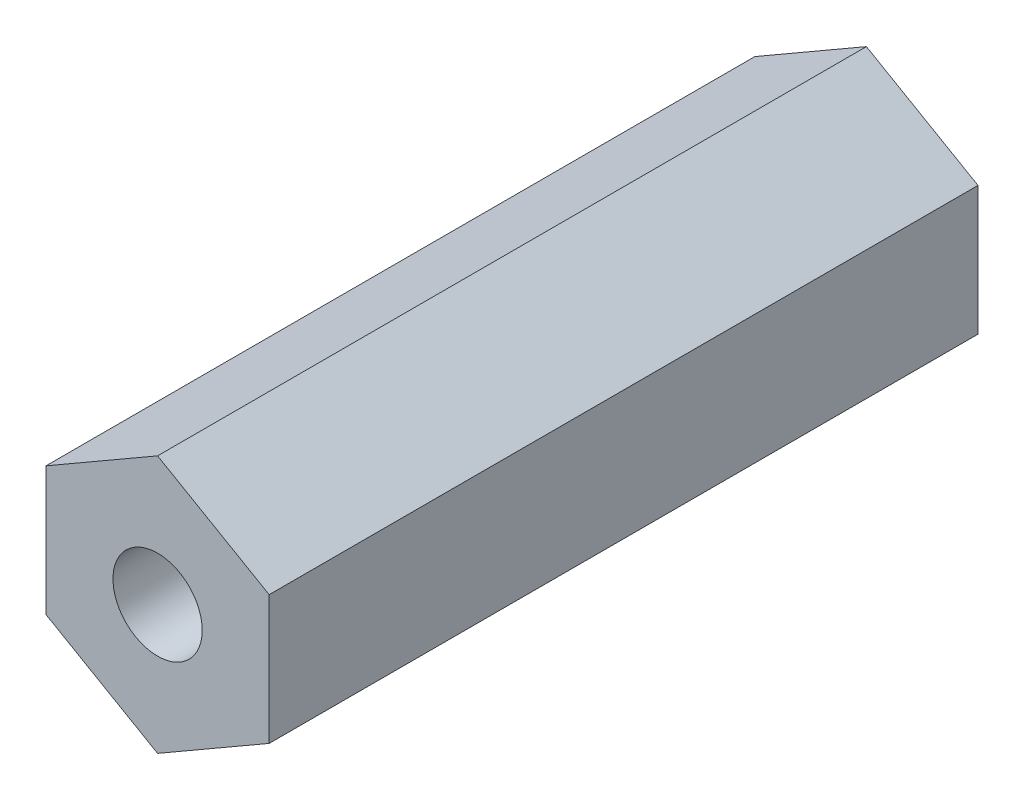
ISO-10303-21;
HEADER;
FILE_DESCRIPTION(('STEP AP214'),'2;1');
FILE_NAME('part.step','',(''),(''),'','','');
FILE_SCHEMA(('AUTOMOTIVE_DESIGN { 1 0 10303 214 1 1 1 1 }'));
ENDSEC;
DATA;
#1=APPLICATION_CONTEXT('core data for automotive mechanical design processes');
#2=APPLICATION_PROTOCOL_DEFINITION('international standard','automotive_design',2000,#1);
#3=PRODUCT_CONTEXT('',#1,'mechanical');
#4=PRODUCT('Part','Part','',(#3));
#5=PRODUCT_RELATED_PRODUCT_CATEGORY('part','',(#4));
#6=PRODUCT_DEFINITION_FORMATION('','',#4);
#7=PRODUCT_DEFINITION_CONTEXT('part definition',#1,'design');
#8=PRODUCT_DEFINITION('design','',#6,#7);
#9=PRODUCT_DEFINITION_SHAPE('','',#8);
#10=(LENGTH_UNIT() NAMED_UNIT(*) SI_UNIT(.MILLI.,.METRE.));
#11=(NAMED_UNIT(*) PLANE_ANGLE_UNIT() SI_UNIT($,.RADIAN.));
#12=(NAMED_UNIT(*) SI_UNIT($,.STERADIAN.) SOLID_ANGLE_UNIT());
#13=UNCERTAINTY_MEASURE_WITH_UNIT(LENGTH_MEASURE(1.E-05),#10,'distance_accuracy_value','');
#14=(GEOMETRIC_REPRESENTATION_CONTEXT(3) GLOBAL_UNCERTAINTY_ASSIGNED_CONTEXT((#13)) GLOBAL_UNIT_ASSIGNED_CONTEXT((#10,
#11,#12)) REPRESENTATION_CONTEXT('',''));
#15=CARTESIAN_POINT('',(0.,0.,0.));
#16=DIRECTION('',(0.,0.,1.));
#17=DIRECTION('',(1.,0.,0.));
#18=AXIS2_PLACEMENT_3D('',#15,#16,#17);
#19=CARTESIAN_POINT('',(6.35,3.66617420935412,20.17));
#20=DIRECTION('',(-0.5,-0.866025403784439,0.));
#21=DIRECTION('',(0.866025403784439,-0.5,0.));
#22=AXIS2_PLACEMENT_3D('',#19,#20,#21);
#23=PLANE('',#22);
#24=DIRECTION('',(-0.866025403784439,0.5,0.));
#25=VECTOR('',#24,1.);
#26=CARTESIAN_POINT('',(6.35,3.66617420935412,-20.17));
#27=LINE('',#26,#25);
#28=CARTESIAN_POINT('',(6.35,3.66617420935412,-20.17));
#29=VERTEX_POINT('',#28);
#30=CARTESIAN_POINT('',(0.,7.33234841870825,-20.17));
#31=VERTEX_POINT('',#30);
#32=EDGE_CURVE('E132',#29,#31,#27,.T.);
#33=ORIENTED_EDGE('',*,*,#32,.T.);
#34=DIRECTION('',(0.,0.,-1.));
#35=VECTOR('',#34,1.);
#36=CARTESIAN_POINT('',(0.,7.33234841870825,20.17));
#37=LINE('',#36,#35);
#38=CARTESIAN_POINT('',(0.,7.33234841870825,20.17));
#39=VERTEX_POINT('',#38);
#40=EDGE_CURVE('E11',#39,#31,#37,.T.);
#41=ORIENTED_EDGE('',*,*,#40,.F.);
#42=DIRECTION('',(-0.866025403784439,0.5,0.));
#43=VECTOR('',#42,1.);
#44=CARTESIAN_POINT('',(6.35,3.66617420935412,20.17));
#45=LINE('',#44,#43);
#46=CARTESIAN_POINT('',(6.35,3.66617420935412,20.17));
#47=VERTEX_POINT('',#46);
#48=EDGE_CURVE('E149',#47,#39,#45,.T.);
#49=ORIENTED_EDGE('',*,*,#48,.F.);
#50=DIRECTION('',(0.,0.,-1.));
#51=VECTOR('',#50,1.);
#52=CARTESIAN_POINT('',(6.35,3.66617420935412,20.17));
#53=LINE('',#52,#51);
#54=EDGE_CURVE('E128',#47,#29,#53,.T.);
#55=ORIENTED_EDGE('',*,*,#54,.T.);
#56=EDGE_LOOP('',(#33,#41,#49,#55));
#57=FACE_BOUND('',#56,.T.);
#58=ADVANCED_FACE('F41',(#57),#23,.F.);
#59=CARTESIAN_POINT('',(0.,7.33234841870825,20.17));
#60=DIRECTION('',(0.5,-0.866025403784439,0.));
#61=DIRECTION('',(0.866025403784439,0.5,0.));
#62=AXIS2_PLACEMENT_3D('',#59,#60,#61);
#63=PLANE('',#62);
#64=DIRECTION('',(-0.866025403784439,-0.5,0.));
#65=VECTOR('',#64,1.);
#66=CARTESIAN_POINT('',(0.,7.33234841870825,-20.17));
#67=LINE('',#66,#65);
#68=CARTESIAN_POINT('',(-6.35,3.66617420935413,-20.17));
#69=VERTEX_POINT('',#68);
#70=EDGE_CURVE('E136',#31,#69,#67,.T.);
#71=ORIENTED_EDGE('',*,*,#70,.T.);
#72=DIRECTION('',(0.,0.,-1.));
#73=VECTOR('',#72,1.);
#74=CARTESIAN_POINT('',(-6.35,3.66617420935413,20.17));
#75=LINE('',#74,#73);
#76=CARTESIAN_POINT('',(-6.35,3.66617420935413,20.17));
#77=VERTEX_POINT('',#76);
#78=EDGE_CURVE('E50',#77,#69,#75,.T.);
#79=ORIENTED_EDGE('',*,*,#78,.F.);
#80=DIRECTION('',(-0.866025403784439,-0.5,0.));
#81=VECTOR('',#80,1.);
#82=CARTESIAN_POINT('',(0.,7.33234841870825,20.17));
#83=LINE('',#82,#81);
#84=EDGE_CURVE('E100',#39,#77,#83,.T.);
#85=ORIENTED_EDGE('',*,*,#84,.F.);
#86=ORIENTED_EDGE('',*,*,#40,.T.);
#87=EDGE_LOOP('',(#71,#79,#85,#86));
#88=FACE_BOUND('',#87,.T.);
#89=ADVANCED_FACE('F178',(#88),#63,.F.);
#90=CARTESIAN_POINT('',(-6.35,3.66617420935413,20.17));
#91=DIRECTION('',(1.,0.,0.));
#92=DIRECTION('',(0.,1.,0.));
#93=AXIS2_PLACEMENT_3D('',#90,#91,#92);
#94=PLANE('',#93);
#95=DIRECTION('',(0.,-1.,0.));
#96=VECTOR('',#95,1.);
#97=CARTESIAN_POINT('',(-6.35,3.66617420935413,-20.17));
#98=LINE('',#97,#96);
#99=CARTESIAN_POINT('',(-6.35,-3.66617420935412,-20.17));
#100=VERTEX_POINT('',#99);
#101=EDGE_CURVE('E140',#69,#100,#98,.T.);
#102=ORIENTED_EDGE('',*,*,#101,.T.);
#103=DIRECTION('',(0.,0.,-1.));
#104=VECTOR('',#103,1.);
#105=CARTESIAN_POINT('',(-6.35,-3.66617420935412,20.17));
#106=LINE('',#105,#104);
#107=CARTESIAN_POINT('',(-6.35,-3.66617420935412,20.17));
#108=VERTEX_POINT('',#107);
#109=EDGE_CURVE('E123',#108,#100,#106,.T.);
#110=ORIENTED_EDGE('',*,*,#109,.F.);
#111=DIRECTION('',(0.,-1.,0.));
#112=VECTOR('',#111,1.);
#113=CARTESIAN_POINT('',(-6.35,3.66617420935413,20.17));
#114=LINE('',#113,#112);
#115=EDGE_CURVE('E113',#77,#108,#114,.T.);
#116=ORIENTED_EDGE('',*,*,#115,.F.);
#117=ORIENTED_EDGE('',*,*,#78,.T.);
#118=EDGE_LOOP('',(#102,#110,#116,#117));
#119=FACE_BOUND('',#118,.T.);
#120=ADVANCED_FACE('F159',(#119),#94,.F.);
#121=CARTESIAN_POINT('',(-6.35,-3.66617420935412,20.17));
#122=DIRECTION('',(0.5,0.866025403784438,0.));
#123=DIRECTION('',(-0.866025403784439,0.5,0.));
#124=AXIS2_PLACEMENT_3D('',#121,#122,#123);
#125=PLANE('',#124);
#126=DIRECTION('',(0.866025403784438,-0.5,0.));
#127=VECTOR('',#126,1.);
#128=CARTESIAN_POINT('',(-6.35,-3.66617420935412,-20.17));
#129=LINE('',#128,#127);
#130=CARTESIAN_POINT('',(0.,-7.33234841870825,-20.17));
#131=VERTEX_POINT('',#130);
#132=EDGE_CURVE('E121',#100,#131,#129,.T.);
#133=ORIENTED_EDGE('',*,*,#132,.T.);
#134=DIRECTION('',(0.,0.,-1.));
#135=VECTOR('',#134,1.);
#136=CARTESIAN_POINT('',(0.,-7.33234841870825,20.17));
#137=LINE('',#136,#135);
#138=CARTESIAN_POINT('',(0.,-7.33234841870825,20.17));
#139=VERTEX_POINT('',#138);
#140=EDGE_CURVE('E118',#139,#131,#137,.T.);
#141=ORIENTED_EDGE('',*,*,#140,.F.);
#142=DIRECTION('',(0.866025403784438,-0.5,0.));
#143=VECTOR('',#142,1.);
#144=CARTESIAN_POINT('',(-6.35,-3.66617420935412,20.17));
#145=LINE('',#144,#143);
#146=EDGE_CURVE('E107',#108,#139,#145,.T.);
#147=ORIENTED_EDGE('',*,*,#146,.F.);
#148=ORIENTED_EDGE('',*,*,#109,.T.);
#149=EDGE_LOOP('',(#133,#141,#147,#148));
#150=FACE_BOUND('',#149,.T.);
#151=ADVANCED_FACE('F119',(#150),#125,.F.);
#152=CARTESIAN_POINT('',(0.,-7.33234841870825,20.17));
#153=DIRECTION('',(-0.5,0.866025403784438,0.));
#154=DIRECTION('',(-0.866025403784439,-0.5,0.));
#155=AXIS2_PLACEMENT_3D('',#152,#153,#154);
#156=PLANE('',#155);
#157=DIRECTION('',(0.866025403784438,0.5,0.));
#158=VECTOR('',#157,1.);
#159=CARTESIAN_POINT('',(0.,-7.33234841870825,-20.17));
#160=LINE('',#159,#158);
#161=CARTESIAN_POINT('',(6.35,-3.66617420935412,-20.17));
#162=VERTEX_POINT('',#161);
#163=EDGE_CURVE('E85',#131,#162,#160,.T.);
#164=ORIENTED_EDGE('',*,*,#163,.T.);
#165=DIRECTION('',(0.,0.,-1.));
#166=VECTOR('',#165,1.);
#167=CARTESIAN_POINT('',(6.35,-3.66617420935412,20.17));
#168=LINE('',#167,#166);
#169=CARTESIAN_POINT('',(6.35,-3.66617420935412,20.17));
#170=VERTEX_POINT('',#169);
#171=EDGE_CURVE('E124',#170,#162,#168,.T.);
#172=ORIENTED_EDGE('',*,*,#171,.F.);
#173=DIRECTION('',(0.866025403784438,0.5,0.));
#174=VECTOR('',#173,1.);
#175=CARTESIAN_POINT('',(0.,-7.33234841870825,20.17));
#176=LINE('',#175,#174);
#177=EDGE_CURVE('E111',#139,#170,#176,.T.);
#178=ORIENTED_EDGE('',*,*,#177,.F.);
#179=ORIENTED_EDGE('',*,*,#140,.T.);
#180=EDGE_LOOP('',(#164,#172,#178,#179));
#181=FACE_BOUND('',#180,.T.);
#182=ADVANCED_FACE('F126',(#181),#156,.F.);
#183=CARTESIAN_POINT('',(6.35,-3.66617420935412,20.17));
#184=DIRECTION('',(-1.,0.,0.));
#185=DIRECTION('',(0.,0.,1.));
#186=AXIS2_PLACEMENT_3D('',#183,#184,#185);
#187=PLANE('',#186);
#188=DIRECTION('',(0.,1.,0.));
#189=VECTOR('',#188,1.);
#190=CARTESIAN_POINT('',(6.35,-3.66617420935412,-20.17));
#191=LINE('',#190,#189);
#192=EDGE_CURVE('E92',#162,#29,#191,.T.);
#193=ORIENTED_EDGE('',*,*,#192,.T.);
#194=ORIENTED_EDGE('',*,*,#54,.F.);
#195=DIRECTION('',(0.,1.,0.));
#196=VECTOR('',#195,1.);
#197=CARTESIAN_POINT('',(6.35,-3.66617420935412,20.17));
#198=LINE('',#197,#196);
#199=EDGE_CURVE('E58',#170,#47,#198,.T.);
#200=ORIENTED_EDGE('',*,*,#199,.F.);
#201=ORIENTED_EDGE('',*,*,#171,.T.);
#202=EDGE_LOOP('',(#193,#194,#200,#201));
#203=FACE_BOUND('',#202,.T.);
#204=ADVANCED_FACE('F166',(#203),#187,.F.);
#205=CARTESIAN_POINT('',(0.,0.,20.17));
#206=DIRECTION('',(0.,0.,1.));
#207=DIRECTION('',(1.,0.,0.));
#208=AXIS2_PLACEMENT_3D('',#205,#206,#207);
#209=PLANE('',#208);
#210=CARTESIAN_POINT('',(0.,0.,20.17));
#211=DIRECTION('',(0.,0.,1.));
#212=DIRECTION('',(1.,0.,0.));
#213=AXIS2_PLACEMENT_3D('',#210,#211,#212);
#214=CIRCLE('',#213,2.54);
#215=CARTESIAN_POINT('',(2.54,0.,20.17));
#216=VERTEX_POINT('',#215);
#217=EDGE_CURVE('E234',#216,#216,#214,.T.);
#218=ORIENTED_EDGE('',*,*,#217,.F.);
#219=EDGE_LOOP('',(#218));
#220=FACE_BOUND('',#219,.T.);
#221=ORIENTED_EDGE('',*,*,#48,.T.);
#222=ORIENTED_EDGE('',*,*,#84,.T.);
#223=ORIENTED_EDGE('',*,*,#115,.T.);
#224=ORIENTED_EDGE('',*,*,#146,.T.);
#225=ORIENTED_EDGE('',*,*,#177,.T.);
#226=ORIENTED_EDGE('',*,*,#199,.T.);
#227=EDGE_LOOP('',(#221,#222,#223,#224,#225,#226));
#228=FACE_BOUND('',#227,.T.);
#229=ADVANCED_FACE('F109',(#220,#228),#209,.T.);
#230=CARTESIAN_POINT('',(0.,0.,-20.17));
#231=DIRECTION('',(0.,0.,1.));
#232=DIRECTION('',(1.,0.,0.));
#233=AXIS2_PLACEMENT_3D('',#230,#231,#232);
#234=PLANE('',#233);
#235=CARTESIAN_POINT('',(0.,0.,-20.17));
#236=DIRECTION('',(0.,0.,1.));
#237=DIRECTION('',(1.,0.,0.));
#238=AXIS2_PLACEMENT_3D('',#235,#236,#237);
#239=CIRCLE('',#238,2.54);
#240=CARTESIAN_POINT('',(2.54,0.,-20.17));
#241=VERTEX_POINT('',#240);
#242=EDGE_CURVE('E137',#241,#241,#239,.T.);
#243=ORIENTED_EDGE('',*,*,#242,.T.);
#244=EDGE_LOOP('',(#243));
#245=FACE_BOUND('',#244,.T.);
#246=ORIENTED_EDGE('',*,*,#32,.F.);
#247=ORIENTED_EDGE('',*,*,#192,.F.);
#248=ORIENTED_EDGE('',*,*,#163,.F.);
#249=ORIENTED_EDGE('',*,*,#132,.F.);
#250=ORIENTED_EDGE('',*,*,#101,.F.);
#251=ORIENTED_EDGE('',*,*,#70,.F.);
#252=EDGE_LOOP('',(#246,#247,#248,#249,#250,#251));
#253=FACE_BOUND('',#252,.T.);
#254=ADVANCED_FACE('F162',(#245,#253),#234,.F.);
#255=CARTESIAN_POINT('',(0.,0.,-20.17));
#256=DIRECTION('',(0.,0.,1.));
#257=DIRECTION('',(1.,0.,0.));
#258=AXIS2_PLACEMENT_3D('',#255,#256,#257);
#259=CYLINDRICAL_SURFACE('',#258,2.54);
#260=ORIENTED_EDGE('',*,*,#242,.F.);
#261=EDGE_LOOP('',(#260));
#262=FACE_BOUND('',#261,.T.);
#263=ORIENTED_EDGE('',*,*,#217,.T.);
#264=EDGE_LOOP('',(#263));
#265=FACE_BOUND('',#264,.T.);
#266=ADVANCED_FACE('F203',(#262,#265),#259,.F.);
#267=CLOSED_SHELL('',(#58,#89,#120,#151,#182,#204,#229,#254,#266));
#268=MANIFOLD_SOLID_BREP('B2',#267);
#269=ADVANCED_BREP_SHAPE_REPRESENTATION('',(#18,#268),#14);
#270=SHAPE_DEFINITION_REPRESENTATION(#9,#269);
ENDSEC;
END-ISO-10303-21;
